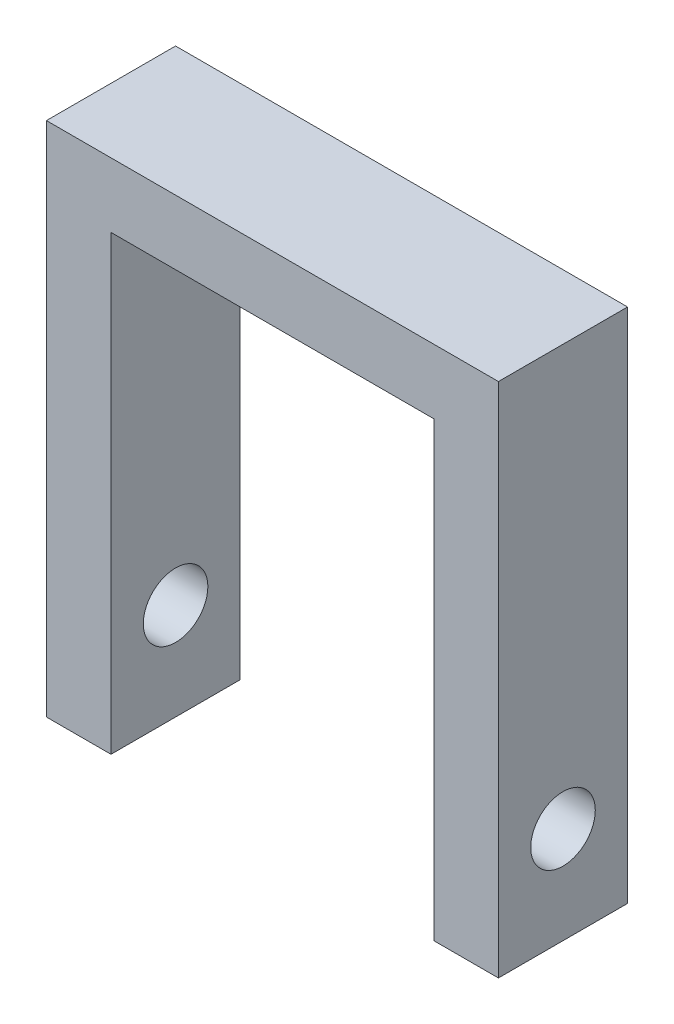
ISO-10303-21;
HEADER;
FILE_DESCRIPTION(('STEP AP214'),'2;1');
FILE_NAME('part.step','',(''),(''),'','','');
FILE_SCHEMA(('AUTOMOTIVE_DESIGN { 1 0 10303 214 1 1 1 1 }'));
ENDSEC;
DATA;
#1=APPLICATION_CONTEXT('core data for automotive mechanical design processes');
#2=APPLICATION_PROTOCOL_DEFINITION('international standard','automotive_design',2000,#1);
#3=PRODUCT_CONTEXT('',#1,'mechanical');
#4=PRODUCT('Part','Part','',(#3));
#5=PRODUCT_RELATED_PRODUCT_CATEGORY('part','',(#4));
#6=PRODUCT_DEFINITION_FORMATION('','',#4);
#7=PRODUCT_DEFINITION_CONTEXT('part definition',#1,'design');
#8=PRODUCT_DEFINITION('design','',#6,#7);
#9=PRODUCT_DEFINITION_SHAPE('','',#8);
#10=(LENGTH_UNIT() NAMED_UNIT(*) SI_UNIT(.MILLI.,.METRE.));
#11=(NAMED_UNIT(*) PLANE_ANGLE_UNIT() SI_UNIT($,.RADIAN.));
#12=(NAMED_UNIT(*) SI_UNIT($,.STERADIAN.) SOLID_ANGLE_UNIT());
#13=UNCERTAINTY_MEASURE_WITH_UNIT(LENGTH_MEASURE(1.E-05),#10,'distance_accuracy_value','');
#14=(GEOMETRIC_REPRESENTATION_CONTEXT(3) GLOBAL_UNCERTAINTY_ASSIGNED_CONTEXT((#13)) GLOBAL_UNIT_ASSIGNED_CONTEXT((#10,
#11,#12)) REPRESENTATION_CONTEXT('',''));
#15=CARTESIAN_POINT('',(0.,0.,0.));
#16=DIRECTION('',(0.,0.,1.));
#17=DIRECTION('',(1.,0.,0.));
#18=AXIS2_PLACEMENT_3D('',#15,#16,#17);
#19=CARTESIAN_POINT('',(0.,0.,20.));
#20=DIRECTION('',(0.,1.,0.));
#21=DIRECTION('',(0.,0.,1.));
#22=AXIS2_PLACEMENT_3D('',#19,#20,#21);
#23=PLANE('',#22);
#24=DIRECTION('',(1.,0.,0.));
#25=VECTOR('',#24,1.);
#26=CARTESIAN_POINT('',(0.,0.,0.));
#27=LINE('',#26,#25);
#28=CARTESIAN_POINT('',(0.,0.,0.));
#29=VERTEX_POINT('',#28);
#30=CARTESIAN_POINT('',(10.,0.,0.));
#31=VERTEX_POINT('',#30);
#32=EDGE_CURVE('E141',#29,#31,#27,.T.);
#33=ORIENTED_EDGE('',*,*,#32,.T.);
#34=DIRECTION('',(0.,0.,-1.));
#35=VECTOR('',#34,1.);
#36=CARTESIAN_POINT('',(10.,0.,20.));
#37=LINE('',#36,#35);
#38=CARTESIAN_POINT('',(10.,0.,20.));
#39=VERTEX_POINT('',#38);
#40=EDGE_CURVE('E11',#39,#31,#37,.T.);
#41=ORIENTED_EDGE('',*,*,#40,.F.);
#42=DIRECTION('',(1.,0.,0.));
#43=VECTOR('',#42,1.);
#44=CARTESIAN_POINT('',(0.,0.,20.));
#45=LINE('',#44,#43);
#46=CARTESIAN_POINT('',(0.,0.,20.));
#47=VERTEX_POINT('',#46);
#48=EDGE_CURVE('E164',#47,#39,#45,.T.);
#49=ORIENTED_EDGE('',*,*,#48,.F.);
#50=DIRECTION('',(0.,0.,-1.));
#51=VECTOR('',#50,1.);
#52=CARTESIAN_POINT('',(0.,0.,20.));
#53=LINE('',#52,#51);
#54=EDGE_CURVE('E137',#47,#29,#53,.T.);
#55=ORIENTED_EDGE('',*,*,#54,.T.);
#56=EDGE_LOOP('',(#33,#41,#49,#55));
#57=FACE_BOUND('',#56,.T.);
#58=ADVANCED_FACE('F39',(#57),#23,.F.);
#59=CARTESIAN_POINT('',(10.,0.,20.));
#60=DIRECTION('',(-1.,0.,0.));
#61=DIRECTION('',(0.,0.,1.));
#62=AXIS2_PLACEMENT_3D('',#59,#60,#61);
#63=PLANE('',#62);
#64=CARTESIAN_POINT('',(10.,15.,10.));
#65=DIRECTION('',(-1.,0.,0.));
#66=DIRECTION('',(0.,0.,1.));
#67=AXIS2_PLACEMENT_3D('',#64,#65,#66);
#68=CIRCLE('',#67,5.);
#69=CARTESIAN_POINT('',(9.99999999999999,15.,5.));
#70=VERTEX_POINT('',#69);
#71=EDGE_CURVE('E216',#70,#70,#68,.T.);
#72=ORIENTED_EDGE('',*,*,#71,.T.);
#73=EDGE_LOOP('',(#72));
#74=FACE_BOUND('',#73,.T.);
#75=DIRECTION('',(0.,1.,0.));
#76=VECTOR('',#75,1.);
#77=CARTESIAN_POINT('',(10.,0.,0.));
#78=LINE('',#77,#76);
#79=CARTESIAN_POINT('',(10.,80.,0.));
#80=VERTEX_POINT('',#79);
#81=EDGE_CURVE('E145',#31,#80,#78,.T.);
#82=ORIENTED_EDGE('',*,*,#81,.T.);
#83=DIRECTION('',(0.,0.,-1.));
#84=VECTOR('',#83,1.);
#85=CARTESIAN_POINT('',(10.,80.,20.));
#86=LINE('',#85,#84);
#87=CARTESIAN_POINT('',(10.,80.,20.));
#88=VERTEX_POINT('',#87);
#89=EDGE_CURVE('E49',#88,#80,#86,.T.);
#90=ORIENTED_EDGE('',*,*,#89,.F.);
#91=DIRECTION('',(0.,1.,0.));
#92=VECTOR('',#91,1.);
#93=CARTESIAN_POINT('',(10.,0.,20.));
#94=LINE('',#93,#92);
#95=EDGE_CURVE('E100',#39,#88,#94,.T.);
#96=ORIENTED_EDGE('',*,*,#95,.F.);
#97=ORIENTED_EDGE('',*,*,#40,.T.);
#98=EDGE_LOOP('',(#82,#90,#96,#97));
#99=FACE_BOUND('',#98,.T.);
#100=ADVANCED_FACE('F221',(#74,#99),#63,.F.);
#101=CARTESIAN_POINT('',(10.,80.,20.));
#102=DIRECTION('',(0.,-1.,0.));
#103=DIRECTION('',(1.,0.,0.));
#104=AXIS2_PLACEMENT_3D('',#101,#102,#103);
#105=PLANE('',#104);
#106=DIRECTION('',(-1.,0.,0.));
#107=VECTOR('',#106,1.);
#108=CARTESIAN_POINT('',(10.,80.,0.));
#109=LINE('',#108,#107);
#110=CARTESIAN_POINT('',(-60.,80.,0.));
#111=VERTEX_POINT('',#110);
#112=EDGE_CURVE('E149',#80,#111,#109,.T.);
#113=ORIENTED_EDGE('',*,*,#112,.T.);
#114=DIRECTION('',(0.,0.,-1.));
#115=VECTOR('',#114,1.);
#116=CARTESIAN_POINT('',(-60.,80.,20.));
#117=LINE('',#116,#115);
#118=CARTESIAN_POINT('',(-60.,80.,20.));
#119=VERTEX_POINT('',#118);
#120=EDGE_CURVE('E175',#119,#111,#117,.T.);
#121=ORIENTED_EDGE('',*,*,#120,.F.);
#122=DIRECTION('',(-1.,0.,0.));
#123=VECTOR('',#122,1.);
#124=CARTESIAN_POINT('',(10.,80.,20.));
#125=LINE('',#124,#123);
#126=EDGE_CURVE('E186',#88,#119,#125,.T.);
#127=ORIENTED_EDGE('',*,*,#126,.F.);
#128=ORIENTED_EDGE('',*,*,#89,.T.);
#129=EDGE_LOOP('',(#113,#121,#127,#128));
#130=FACE_BOUND('',#129,.T.);
#131=ADVANCED_FACE('F184',(#130),#105,.F.);
#132=CARTESIAN_POINT('',(-60.,80.,20.));
#133=DIRECTION('',(1.,0.,0.));
#134=DIRECTION('',(0.,1.,0.));
#135=AXIS2_PLACEMENT_3D('',#132,#133,#134);
#136=PLANE('',#135);
#137=CARTESIAN_POINT('',(-60.,15.,10.));
#138=DIRECTION('',(-1.,0.,0.));
#139=DIRECTION('',(0.,0.,1.));
#140=AXIS2_PLACEMENT_3D('',#137,#138,#139);
#141=CIRCLE('',#140,5.);
#142=CARTESIAN_POINT('',(-60.,15.,5.));
#143=VERTEX_POINT('',#142);
#144=EDGE_CURVE('E212',#143,#143,#141,.T.);
#145=ORIENTED_EDGE('',*,*,#144,.F.);
#146=EDGE_LOOP('',(#145));
#147=FACE_BOUND('',#146,.T.);
#148=DIRECTION('',(0.,-1.,0.));
#149=VECTOR('',#148,1.);
#150=CARTESIAN_POINT('',(-60.,80.,0.));
#151=LINE('',#150,#149);
#152=CARTESIAN_POINT('',(-60.,0.,0.));
#153=VERTEX_POINT('',#152);
#154=EDGE_CURVE('E152',#111,#153,#151,.T.);
#155=ORIENTED_EDGE('',*,*,#154,.T.);
#156=DIRECTION('',(0.,0.,-1.));
#157=VECTOR('',#156,1.);
#158=CARTESIAN_POINT('',(-60.,0.,20.));
#159=LINE('',#158,#157);
#160=CARTESIAN_POINT('',(-60.,0.,20.));
#161=VERTEX_POINT('',#160);
#162=EDGE_CURVE('E171',#161,#153,#159,.T.);
#163=ORIENTED_EDGE('',*,*,#162,.F.);
#164=DIRECTION('',(0.,-1.,0.));
#165=VECTOR('',#164,1.);
#166=CARTESIAN_POINT('',(-60.,80.,20.));
#167=LINE('',#166,#165);
#168=EDGE_CURVE('E199',#119,#161,#167,.T.);
#169=ORIENTED_EDGE('',*,*,#168,.F.);
#170=ORIENTED_EDGE('',*,*,#120,.T.);
#171=EDGE_LOOP('',(#155,#163,#169,#170));
#172=FACE_BOUND('',#171,.T.);
#173=ADVANCED_FACE('F194',(#147,#172),#136,.F.);
#174=CARTESIAN_POINT('',(-60.,0.,20.));
#175=DIRECTION('',(0.,1.,0.));
#176=DIRECTION('',(-1.,0.,0.));
#177=AXIS2_PLACEMENT_3D('',#174,#175,#176);
#178=PLANE('',#177);
#179=DIRECTION('',(1.,0.,0.));
#180=VECTOR('',#179,1.);
#181=CARTESIAN_POINT('',(-60.,0.,0.));
#182=LINE('',#181,#180);
#183=CARTESIAN_POINT('',(-50.,0.,0.));
#184=VERTEX_POINT('',#183);
#185=EDGE_CURVE('E155',#153,#184,#182,.T.);
#186=ORIENTED_EDGE('',*,*,#185,.T.);
#187=DIRECTION('',(0.,0.,-1.));
#188=VECTOR('',#187,1.);
#189=CARTESIAN_POINT('',(-50.,0.,20.));
#190=LINE('',#189,#188);
#191=CARTESIAN_POINT('',(-50.,0.,20.));
#192=VERTEX_POINT('',#191);
#193=EDGE_CURVE('E130',#192,#184,#190,.T.);
#194=ORIENTED_EDGE('',*,*,#193,.F.);
#195=DIRECTION('',(1.,0.,0.));
#196=VECTOR('',#195,1.);
#197=CARTESIAN_POINT('',(-60.,0.,20.));
#198=LINE('',#197,#196);
#199=EDGE_CURVE('E119',#161,#192,#198,.T.);
#200=ORIENTED_EDGE('',*,*,#199,.F.);
#201=ORIENTED_EDGE('',*,*,#162,.T.);
#202=EDGE_LOOP('',(#186,#194,#200,#201));
#203=FACE_BOUND('',#202,.T.);
#204=ADVANCED_FACE('F197',(#203),#178,.F.);
#205=CARTESIAN_POINT('',(-50.,70.,20.));
#206=DIRECTION('',(-1.,0.,0.));
#207=DIRECTION('',(0.,0.,1.));
#208=AXIS2_PLACEMENT_3D('',#205,#206,#207);
#209=PLANE('',#208);
#210=CARTESIAN_POINT('',(-50.,15.,10.));
#211=DIRECTION('',(-1.,0.,0.));
#212=DIRECTION('',(0.,0.,1.));
#213=AXIS2_PLACEMENT_3D('',#210,#211,#212);
#214=CIRCLE('',#213,5.);
#215=CARTESIAN_POINT('',(-50.,15.,5.));
#216=VERTEX_POINT('',#215);
#217=EDGE_CURVE('E146',#216,#216,#214,.F.);
#218=ORIENTED_EDGE('',*,*,#217,.F.);
#219=EDGE_LOOP('',(#218));
#220=FACE_BOUND('',#219,.T.);
#221=DIRECTION('',(0.,1.,0.));
#222=VECTOR('',#221,1.);
#223=CARTESIAN_POINT('',(-50.,70.,0.));
#224=LINE('',#223,#222);
#225=CARTESIAN_POINT('',(-50.,70.,0.));
#226=VERTEX_POINT('',#225);
#227=EDGE_CURVE('E128',#184,#226,#224,.T.);
#228=ORIENTED_EDGE('',*,*,#227,.T.);
#229=DIRECTION('',(0.,0.,-1.));
#230=VECTOR('',#229,1.);
#231=CARTESIAN_POINT('',(-50.,70.,20.));
#232=LINE('',#231,#230);
#233=CARTESIAN_POINT('',(-50.,70.,20.));
#234=VERTEX_POINT('',#233);
#235=EDGE_CURVE('E125',#234,#226,#232,.T.);
#236=ORIENTED_EDGE('',*,*,#235,.F.);
#237=DIRECTION('',(0.,1.,0.));
#238=VECTOR('',#237,1.);
#239=CARTESIAN_POINT('',(-50.,70.,20.));
#240=LINE('',#239,#238);
#241=EDGE_CURVE('E113',#192,#234,#240,.T.);
#242=ORIENTED_EDGE('',*,*,#241,.F.);
#243=ORIENTED_EDGE('',*,*,#193,.T.);
#244=EDGE_LOOP('',(#228,#236,#242,#243));
#245=FACE_BOUND('',#244,.T.);
#246=ADVANCED_FACE('F126',(#220,#245),#209,.F.);
#247=CARTESIAN_POINT('',(0.,70.,20.));
#248=DIRECTION('',(0.,1.,0.));
#249=DIRECTION('',(0.,0.,1.));
#250=AXIS2_PLACEMENT_3D('',#247,#248,#249);
#251=PLANE('',#250);
#252=DIRECTION('',(1.,0.,0.));
#253=VECTOR('',#252,1.);
#254=CARTESIAN_POINT('',(0.,70.,0.));
#255=LINE('',#254,#253);
#256=CARTESIAN_POINT('',(0.,70.,0.));
#257=VERTEX_POINT('',#256);
#258=EDGE_CURVE('E86',#226,#257,#255,.T.);
#259=ORIENTED_EDGE('',*,*,#258,.T.);
#260=DIRECTION('',(0.,0.,-1.));
#261=VECTOR('',#260,1.);
#262=CARTESIAN_POINT('',(0.,70.,20.));
#263=LINE('',#262,#261);
#264=CARTESIAN_POINT('',(0.,70.,20.));
#265=VERTEX_POINT('',#264);
#266=EDGE_CURVE('E131',#265,#257,#263,.T.);
#267=ORIENTED_EDGE('',*,*,#266,.F.);
#268=DIRECTION('',(1.,0.,0.));
#269=VECTOR('',#268,1.);
#270=CARTESIAN_POINT('',(0.,70.,20.));
#271=LINE('',#270,#269);
#272=EDGE_CURVE('E117',#234,#265,#271,.T.);
#273=ORIENTED_EDGE('',*,*,#272,.F.);
#274=ORIENTED_EDGE('',*,*,#235,.T.);
#275=EDGE_LOOP('',(#259,#267,#273,#274));
#276=FACE_BOUND('',#275,.T.);
#277=ADVANCED_FACE('F133',(#276),#251,.F.);
#278=CARTESIAN_POINT('',(0.,0.,20.));
#279=DIRECTION('',(1.,0.,0.));
#280=DIRECTION('',(0.,0.,-1.));
#281=AXIS2_PLACEMENT_3D('',#278,#279,#280);
#282=PLANE('',#281);
#283=CARTESIAN_POINT('',(0.,15.,10.));
#284=DIRECTION('',(1.,0.,0.));
#285=DIRECTION('',(0.,0.,-1.));
#286=AXIS2_PLACEMENT_3D('',#283,#284,#285);
#287=CIRCLE('',#286,5.);
#288=CARTESIAN_POINT('',(0.,15.,5.));
#289=VERTEX_POINT('',#288);
#290=EDGE_CURVE('E42',#289,#289,#287,.F.);
#291=ORIENTED_EDGE('',*,*,#290,.F.);
#292=EDGE_LOOP('',(#291));
#293=FACE_BOUND('',#292,.T.);
#294=DIRECTION('',(0.,-1.,0.));
#295=VECTOR('',#294,1.);
#296=CARTESIAN_POINT('',(0.,0.,0.));
#297=LINE('',#296,#295);
#298=EDGE_CURVE('E92',#257,#29,#297,.T.);
#299=ORIENTED_EDGE('',*,*,#298,.T.);
#300=ORIENTED_EDGE('',*,*,#54,.F.);
#301=DIRECTION('',(0.,-1.,0.));
#302=VECTOR('',#301,1.);
#303=CARTESIAN_POINT('',(0.,0.,20.));
#304=LINE('',#303,#302);
#305=EDGE_CURVE('E57',#265,#47,#304,.T.);
#306=ORIENTED_EDGE('',*,*,#305,.F.);
#307=ORIENTED_EDGE('',*,*,#266,.T.);
#308=EDGE_LOOP('',(#299,#300,#306,#307));
#309=FACE_BOUND('',#308,.T.);
#310=ADVANCED_FACE('F232',(#293,#309),#282,.F.);
#311=CARTESIAN_POINT('',(0.,0.,20.));
#312=DIRECTION('',(0.,0.,1.));
#313=DIRECTION('',(1.,0.,0.));
#314=AXIS2_PLACEMENT_3D('',#311,#312,#313);
#315=PLANE('',#314);
#316=ORIENTED_EDGE('',*,*,#48,.T.);
#317=ORIENTED_EDGE('',*,*,#95,.T.);
#318=ORIENTED_EDGE('',*,*,#126,.T.);
#319=ORIENTED_EDGE('',*,*,#168,.T.);
#320=ORIENTED_EDGE('',*,*,#199,.T.);
#321=ORIENTED_EDGE('',*,*,#241,.T.);
#322=ORIENTED_EDGE('',*,*,#272,.T.);
#323=ORIENTED_EDGE('',*,*,#305,.T.);
#324=EDGE_LOOP('',(#316,#317,#318,#319,#320,#321,#322,#323));
#325=FACE_BOUND('',#324,.T.);
#326=ADVANCED_FACE('F115',(#325),#315,.T.);
#327=CARTESIAN_POINT('',(0.,0.,0.));
#328=DIRECTION('',(0.,0.,1.));
#329=DIRECTION('',(1.,0.,0.));
#330=AXIS2_PLACEMENT_3D('',#327,#328,#329);
#331=PLANE('',#330);
#332=ORIENTED_EDGE('',*,*,#32,.F.);
#333=ORIENTED_EDGE('',*,*,#298,.F.);
#334=ORIENTED_EDGE('',*,*,#258,.F.);
#335=ORIENTED_EDGE('',*,*,#227,.F.);
#336=ORIENTED_EDGE('',*,*,#185,.F.);
#337=ORIENTED_EDGE('',*,*,#154,.F.);
#338=ORIENTED_EDGE('',*,*,#112,.F.);
#339=ORIENTED_EDGE('',*,*,#81,.F.);
#340=EDGE_LOOP('',(#332,#333,#334,#335,#336,#337,#338,#339));
#341=FACE_BOUND('',#340,.T.);
#342=ADVANCED_FACE('F190',(#341),#331,.F.);
#343=CARTESIAN_POINT('',(-60.,15.,10.));
#344=DIRECTION('',(1.,0.,0.));
#345=DIRECTION('',(0.,0.,-1.));
#346=AXIS2_PLACEMENT_3D('',#343,#344,#345);
#347=CYLINDRICAL_SURFACE('',#346,5.);
#348=CARTESIAN_POINT('',(9.99999999999999,15.,5.));
#349=CARTESIAN_POINT('',(9.89583333333333,15.,5.));
#350=CARTESIAN_POINT('',(9.79166666666666,15.,5.));
#351=CARTESIAN_POINT('',(9.58333333333333,15.,5.));
#352=CARTESIAN_POINT('',(9.47916666666666,15.,5.));
#353=CARTESIAN_POINT('',(9.27083333333332,15.,5.));
#354=CARTESIAN_POINT('',(9.16666666666666,15.,5.));
#355=CARTESIAN_POINT('',(8.95833333333333,15.,5.));
#356=CARTESIAN_POINT('',(8.85416666666666,15.,5.));
#357=CARTESIAN_POINT('',(8.64583333333332,15.,5.));
#358=CARTESIAN_POINT('',(8.54166666666666,15.,5.));
#359=CARTESIAN_POINT('',(8.33333333333333,15.,5.));
#360=CARTESIAN_POINT('',(8.22916666666666,15.,5.));
#361=CARTESIAN_POINT('',(8.02083333333332,15.,5.));
#362=CARTESIAN_POINT('',(7.91666666666666,15.,5.));
#363=CARTESIAN_POINT('',(7.70833333333332,15.,5.));
#364=CARTESIAN_POINT('',(7.60416666666665,15.,5.));
#365=CARTESIAN_POINT('',(7.39583333333332,15.,5.));
#366=CARTESIAN_POINT('',(7.29166666666666,15.,5.));
#367=CARTESIAN_POINT('',(7.08333333333332,15.,5.));
#368=CARTESIAN_POINT('',(6.97916666666665,15.,5.));
#369=CARTESIAN_POINT('',(6.77083333333332,15.,5.));
#370=CARTESIAN_POINT('',(6.66666666666666,15.,5.));
#371=CARTESIAN_POINT('',(6.45833333333332,15.,5.));
#372=CARTESIAN_POINT('',(6.35416666666665,15.,5.));
#373=CARTESIAN_POINT('',(6.14583333333332,15.,5.));
#374=CARTESIAN_POINT('',(6.04166666666666,15.,5.));
#375=CARTESIAN_POINT('',(5.83333333333332,15.,5.));
#376=CARTESIAN_POINT('',(5.72916666666665,15.,5.));
#377=CARTESIAN_POINT('',(5.52083333333332,15.,5.));
#378=CARTESIAN_POINT('',(5.41666666666666,15.,5.));
#379=CARTESIAN_POINT('',(5.20833333333332,15.,5.));
#380=CARTESIAN_POINT('',(5.10416666666665,15.,5.));
#381=CARTESIAN_POINT('',(4.89583333333332,15.,5.));
#382=CARTESIAN_POINT('',(4.79166666666666,15.,5.));
#383=CARTESIAN_POINT('',(4.58333333333333,15.,5.));
#384=CARTESIAN_POINT('',(4.47916666666666,15.,5.));
#385=CARTESIAN_POINT('',(4.27083333333333,15.,5.));
#386=CARTESIAN_POINT('',(4.16666666666666,15.,5.));
#387=CARTESIAN_POINT('',(3.95833333333333,15.,5.));
#388=CARTESIAN_POINT('',(3.85416666666666,15.,5.));
#389=CARTESIAN_POINT('',(3.64583333333333,15.,5.));
#390=CARTESIAN_POINT('',(3.54166666666666,15.,5.));
#391=CARTESIAN_POINT('',(3.33333333333333,15.,5.));
#392=CARTESIAN_POINT('',(3.22916666666666,15.,5.));
#393=CARTESIAN_POINT('',(3.02083333333333,15.,5.));
#394=CARTESIAN_POINT('',(2.91666666666666,15.,5.));
#395=CARTESIAN_POINT('',(2.70833333333332,15.,5.));
#396=CARTESIAN_POINT('',(2.60416666666666,15.,5.));
#397=CARTESIAN_POINT('',(2.39583333333333,15.,5.));
#398=CARTESIAN_POINT('',(2.29166666666666,15.,5.));
#399=CARTESIAN_POINT('',(2.08333333333333,15.,5.));
#400=CARTESIAN_POINT('',(1.97916666666667,15.,5.));
#401=CARTESIAN_POINT('',(1.77083333333334,15.,5.));
#402=CARTESIAN_POINT('',(1.66666666666667,15.,5.));
#403=CARTESIAN_POINT('',(1.45833333333333,15.,5.));
#404=CARTESIAN_POINT('',(1.35416666666667,15.,5.));
#405=CARTESIAN_POINT('',(1.14583333333333,15.,5.));
#406=CARTESIAN_POINT('',(1.04166666666667,15.,5.));
#407=CARTESIAN_POINT('',(0.833333333333334,15.,5.));
#408=CARTESIAN_POINT('',(0.729166666666667,15.,5.));
#409=CARTESIAN_POINT('',(0.520833333333334,15.,5.));
#410=CARTESIAN_POINT('',(0.416666666666667,15.,5.));
#411=CARTESIAN_POINT('',(0.208333333333334,15.,5.));
#412=CARTESIAN_POINT('',(0.104166666666667,15.,5.));
#413=CARTESIAN_POINT('',(0.,15.,5.));
#414=B_SPLINE_CURVE_WITH_KNOTS('',3,(#348,#349,#350,#351,#352,#353,#354,#355,#356,#357,#358,
#359,#360,#361,#362,#363,#364,#365,#366,#367,#368,#369,#370,#371,#372,#373,#374,#375,#376,#377,
#378,#379,#380,#381,#382,#383,#384,#385,#386,#387,#388,#389,#390,#391,#392,#393,#394,#395,#396,
#397,#398,#399,#400,#401,#402,#403,#404,#405,#406,#407,#408,#409,#410,#411,#412,#413),
.UNSPECIFIED.,.F.,.F.,(4,2,2,2,2,2,2,2,2,2,2,2,2,2,2,2,2,2,2,2,2,2,2,2,2,2,2,2,2,2,2,2,4),(0.,
0.312499999999993,0.625000000000001,0.937499999999994,1.25,1.56249999999999,1.875,2.1875,2.5,
2.8125,3.125,3.4375,3.75,4.0625,4.375,4.6875,5.,5.3125,5.62499999999999,5.9375,6.24999999999999,
6.5625,6.87499999999999,7.1875,7.49999999999999,7.81249999999999,8.12499999999999,
8.43749999999999,8.74999999999999,9.06249999999999,9.37499999999999,9.68749999999999,
9.99999999999999),.UNSPECIFIED.);
#415=EDGE_CURVE('BSEAM223',#70,#289,#414,.T.);
#416=ORIENTED_EDGE('',*,*,#71,.F.);
#417=ORIENTED_EDGE('',*,*,#290,.T.);
#418=ORIENTED_EDGE('',*,*,#415,.T.);
#419=ORIENTED_EDGE('',*,*,#415,.F.);
#420=EDGE_LOOP('',(#416,#418,#417,#419));
#421=FACE_BOUND('',#420,.T.);
#422=ADVANCED_FACE('F223',(#421),#347,.F.);
#423=CARTESIAN_POINT('',(-60.,15.,5.));
#424=CARTESIAN_POINT('',(-59.8958333333333,15.,5.));
#425=CARTESIAN_POINT('',(-59.7916666666667,15.,5.));
#426=CARTESIAN_POINT('',(-59.5833333333333,15.,5.));
#427=CARTESIAN_POINT('',(-59.4791666666667,15.,5.));
#428=CARTESIAN_POINT('',(-59.2708333333333,15.,5.));
#429=CARTESIAN_POINT('',(-59.1666666666667,15.,5.));
#430=CARTESIAN_POINT('',(-58.9583333333333,15.,5.));
#431=CARTESIAN_POINT('',(-58.8541666666667,15.,5.));
#432=CARTESIAN_POINT('',(-58.6458333333333,15.,5.));
#433=CARTESIAN_POINT('',(-58.5416666666667,15.,5.));
#434=CARTESIAN_POINT('',(-58.3333333333333,15.,5.));
#435=CARTESIAN_POINT('',(-58.2291666666667,15.,5.));
#436=CARTESIAN_POINT('',(-58.0208333333333,15.,5.));
#437=CARTESIAN_POINT('',(-57.9166666666667,15.,5.));
#438=CARTESIAN_POINT('',(-57.7083333333333,15.,5.));
#439=CARTESIAN_POINT('',(-57.6041666666667,15.,5.));
#440=CARTESIAN_POINT('',(-57.3958333333333,15.,5.));
#441=CARTESIAN_POINT('',(-57.2916666666667,15.,5.));
#442=CARTESIAN_POINT('',(-57.0833333333333,15.,5.));
#443=CARTESIAN_POINT('',(-56.9791666666667,15.,5.));
#444=CARTESIAN_POINT('',(-56.7708333333333,15.,5.));
#445=CARTESIAN_POINT('',(-56.6666666666667,15.,5.));
#446=CARTESIAN_POINT('',(-56.4583333333333,15.,5.));
#447=CARTESIAN_POINT('',(-56.3541666666667,15.,5.));
#448=CARTESIAN_POINT('',(-56.1458333333333,15.,5.));
#449=CARTESIAN_POINT('',(-56.0416666666667,15.,5.));
#450=CARTESIAN_POINT('',(-55.8333333333333,15.,5.));
#451=CARTESIAN_POINT('',(-55.7291666666667,15.,5.));
#452=CARTESIAN_POINT('',(-55.5208333333333,15.,5.));
#453=CARTESIAN_POINT('',(-55.4166666666667,15.,5.));
#454=CARTESIAN_POINT('',(-55.2083333333333,15.,5.));
#455=CARTESIAN_POINT('',(-55.1041666666667,15.,5.));
#456=CARTESIAN_POINT('',(-54.8958333333333,15.,5.));
#457=CARTESIAN_POINT('',(-54.7916666666667,15.,5.));
#458=CARTESIAN_POINT('',(-54.5833333333333,15.,5.));
#459=CARTESIAN_POINT('',(-54.4791666666667,15.,5.));
#460=CARTESIAN_POINT('',(-54.2708333333333,15.,5.));
#461=CARTESIAN_POINT('',(-54.1666666666667,15.,5.));
#462=CARTESIAN_POINT('',(-53.9583333333333,15.,5.));
#463=CARTESIAN_POINT('',(-53.8541666666667,15.,5.));
#464=CARTESIAN_POINT('',(-53.6458333333333,15.,5.));
#465=CARTESIAN_POINT('',(-53.5416666666667,15.,5.));
#466=CARTESIAN_POINT('',(-53.3333333333333,15.,5.));
#467=CARTESIAN_POINT('',(-53.2291666666667,15.,5.));
#468=CARTESIAN_POINT('',(-53.0208333333333,15.,5.));
#469=CARTESIAN_POINT('',(-52.9166666666667,15.,5.));
#470=CARTESIAN_POINT('',(-52.7083333333333,15.,5.));
#471=CARTESIAN_POINT('',(-52.6041666666667,15.,5.));
#472=CARTESIAN_POINT('',(-52.3958333333333,15.,5.));
#473=CARTESIAN_POINT('',(-52.2916666666667,15.,5.));
#474=CARTESIAN_POINT('',(-52.0833333333333,15.,5.));
#475=CARTESIAN_POINT('',(-51.9791666666667,15.,5.));
#476=CARTESIAN_POINT('',(-51.7708333333333,15.,5.));
#477=CARTESIAN_POINT('',(-51.6666666666667,15.,5.));
#478=CARTESIAN_POINT('',(-51.4583333333333,15.,5.));
#479=CARTESIAN_POINT('',(-51.3541666666667,15.,5.));
#480=CARTESIAN_POINT('',(-51.1458333333333,15.,5.));
#481=CARTESIAN_POINT('',(-51.0416666666667,15.,5.));
#482=CARTESIAN_POINT('',(-50.8333333333333,15.,5.));
#483=CARTESIAN_POINT('',(-50.7291666666667,15.,5.));
#484=CARTESIAN_POINT('',(-50.5208333333333,15.,5.));
#485=CARTESIAN_POINT('',(-50.4166666666667,15.,5.));
#486=CARTESIAN_POINT('',(-50.2083333333333,15.,5.));
#487=CARTESIAN_POINT('',(-50.1041666666667,15.,5.));
#488=CARTESIAN_POINT('',(-50.,15.,5.));
#489=B_SPLINE_CURVE_WITH_KNOTS('',3,(#423,#424,#425,#426,#427,#428,#429,#430,#431,#432,#433,
#434,#435,#436,#437,#438,#439,#440,#441,#442,#443,#444,#445,#446,#447,#448,#449,#450,#451,#452,
#453,#454,#455,#456,#457,#458,#459,#460,#461,#462,#463,#464,#465,#466,#467,#468,#469,#470,#471,
#472,#473,#474,#475,#476,#477,#478,#479,#480,#481,#482,#483,#484,#485,#486,#487,#488),
.UNSPECIFIED.,.F.,.F.,(4,2,2,2,2,2,2,2,2,2,2,2,2,2,2,2,2,2,2,2,2,2,2,2,2,2,2,2,2,2,2,2,4),(0.,
0.3125,0.625000000000001,0.937500000000001,1.25,1.5625,1.875,2.1875,2.5,2.8125,3.125,3.4375,
3.75,4.0625,4.375,4.6875,5.,5.3125,5.62500000000001,5.93750000000001,6.25000000000001,
6.56250000000001,6.87500000000001,7.18750000000001,7.50000000000001,7.81250000000001,
8.12500000000001,8.43750000000001,8.75000000000001,9.06250000000001,9.37500000000001,
9.68750000000001,10.),.UNSPECIFIED.);
#490=EDGE_CURVE('BSEAM226',#143,#216,#489,.T.);
#491=ORIENTED_EDGE('',*,*,#144,.T.);
#492=ORIENTED_EDGE('',*,*,#217,.T.);
#493=ORIENTED_EDGE('',*,*,#490,.T.);
#494=ORIENTED_EDGE('',*,*,#490,.F.);
#495=EDGE_LOOP('',(#491,#493,#492,#494));
#496=FACE_BOUND('',#495,.T.);
#497=ADVANCED_FACE('F226',(#496),#347,.F.);
#498=CLOSED_SHELL('',(#58,#100,#131,#173,#204,#246,#277,#310,#326,#342,#422,#497));
#499=MANIFOLD_SOLID_BREP('B2',#498);
#500=ADVANCED_BREP_SHAPE_REPRESENTATION('',(#18,#499),#14);
#501=SHAPE_DEFINITION_REPRESENTATION(#9,#500);
ENDSEC;
END-ISO-10303-21;
